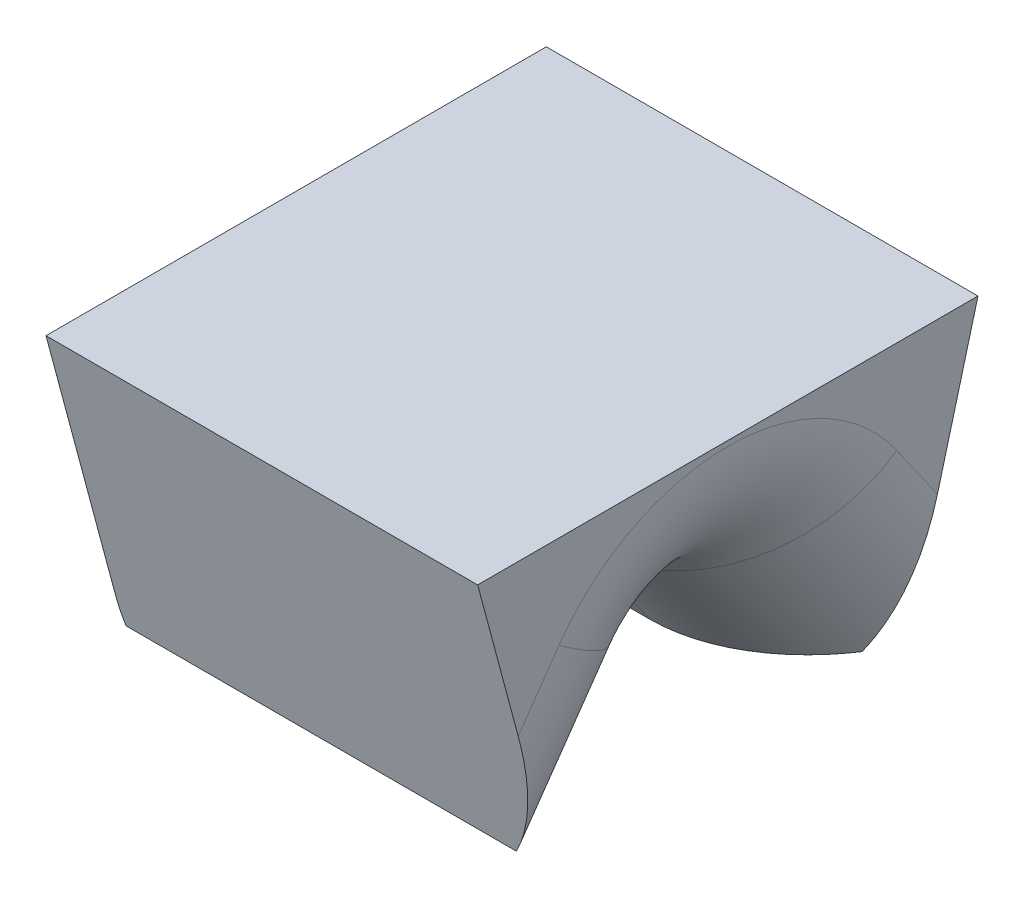
ISO-10303-21;
HEADER;
FILE_DESCRIPTION(('STEP AP214'),'2;1');
FILE_NAME('part.step','',(''),(''),'','','');
FILE_SCHEMA(('AUTOMOTIVE_DESIGN { 1 0 10303 214 1 1 1 1 }'));
ENDSEC;
DATA;
#1=APPLICATION_CONTEXT('core data for automotive mechanical design processes');
#2=APPLICATION_PROTOCOL_DEFINITION('international standard','automotive_design',2000,#1);
#3=PRODUCT_CONTEXT('',#1,'mechanical');
#4=PRODUCT('Part','Part','',(#3));
#5=PRODUCT_RELATED_PRODUCT_CATEGORY('part','',(#4));
#6=PRODUCT_DEFINITION_FORMATION('','',#4);
#7=PRODUCT_DEFINITION_CONTEXT('part definition',#1,'design');
#8=PRODUCT_DEFINITION('design','',#6,#7);
#9=PRODUCT_DEFINITION_SHAPE('','',#8);
#10=(LENGTH_UNIT() NAMED_UNIT(*) SI_UNIT(.MILLI.,.METRE.));
#11=(NAMED_UNIT(*) PLANE_ANGLE_UNIT() SI_UNIT($,.RADIAN.));
#12=(NAMED_UNIT(*) SI_UNIT($,.STERADIAN.) SOLID_ANGLE_UNIT());
#13=UNCERTAINTY_MEASURE_WITH_UNIT(LENGTH_MEASURE(1.E-05),#10,'distance_accuracy_value','');
#14=(GEOMETRIC_REPRESENTATION_CONTEXT(3) GLOBAL_UNCERTAINTY_ASSIGNED_CONTEXT((#13)) GLOBAL_UNIT_ASSIGNED_CONTEXT((#10,
#11,#12)) REPRESENTATION_CONTEXT('',''));
#15=CARTESIAN_POINT('',(0.,0.,0.));
#16=DIRECTION('',(0.,0.,1.));
#17=DIRECTION('',(1.,0.,0.));
#18=AXIS2_PLACEMENT_3D('',#15,#16,#17);
#19=CARTESIAN_POINT('',(0.,0.835526315789467,0.));
#20=DIRECTION('',(0.,1.,0.));
#21=DIRECTION('',(0.,0.,1.));
#22=AXIS2_PLACEMENT_3D('',#19,#20,#21);
#23=PLANE('',#22);
#24=DIRECTION('',(0.,0.,-1.));
#25=VECTOR('',#24,1.);
#26=CARTESIAN_POINT('',(-0.20193,0.835526315789467,2.00770998));
#27=LINE('',#26,#25);
#28=CARTESIAN_POINT('',(-0.20193,0.835526315789467,0.72425860157074));
#29=VERTEX_POINT('',#28);
#30=CARTESIAN_POINT('',(-0.20193,0.835526315789467,-0.72425860157074));
#31=VERTEX_POINT('',#30);
#32=EDGE_CURVE('E317',#29,#31,#27,.T.);
#33=ORIENTED_EDGE('',*,*,#32,.F.);
#34=DIRECTION('',(-1.,0.,0.));
#35=VECTOR('',#34,1.);
#36=CARTESIAN_POINT('',(2.00770998,0.835526315789467,0.72425860157074));
#37=LINE('',#36,#35);
#38=CARTESIAN_POINT('',(1.04775,0.835526315789467,0.72425860157074));
#39=VERTEX_POINT('',#38);
#40=EDGE_CURVE('E57',#39,#29,#37,.T.);
#41=ORIENTED_EDGE('',*,*,#40,.F.);
#42=DIRECTION('',(0.,0.,1.));
#43=VECTOR('',#42,1.);
#44=CARTESIAN_POINT('',(1.04775,0.835526315789467,2.00770998));
#45=LINE('',#44,#43);
#46=CARTESIAN_POINT('',(1.04775,0.835526315789467,-0.72425860157074));
#47=VERTEX_POINT('',#46);
#48=EDGE_CURVE('E12',#47,#39,#45,.T.);
#49=ORIENTED_EDGE('',*,*,#48,.F.);
#50=DIRECTION('',(1.,0.,0.));
#51=VECTOR('',#50,1.);
#52=CARTESIAN_POINT('',(2.00770998,0.835526315789467,-0.72425860157074));
#53=LINE('',#52,#51);
#54=EDGE_CURVE('E129',#31,#47,#53,.T.);
#55=ORIENTED_EDGE('',*,*,#54,.F.);
#56=EDGE_LOOP('',(#33,#41,#49,#55));
#57=FACE_BOUND('',#56,.T.);
#58=ADVANCED_FACE('F42',(#57),#23,.T.);
#59=CARTESIAN_POINT('',(2.00770998,0.,0.50038));
#60=DIRECTION('',(0.,-0.258819045102522,0.965925826289068));
#61=DIRECTION('',(0.,-0.965925826289068,-0.258819045102522));
#62=AXIS2_PLACEMENT_3D('',#59,#60,#61);
#63=PLANE('',#62);
#64=DIRECTION('',(0.,0.965925826289068,0.258819045102522));
#65=VECTOR('',#64,1.);
#66=CARTESIAN_POINT('',(1.04775,0.,0.50038));
#67=LINE('',#66,#65);
#68=CARTESIAN_POINT('',(1.04775,0.397467402532683,0.606881069526329));
#69=VERTEX_POINT('',#68);
#70=EDGE_CURVE('E147',#69,#39,#67,.T.);
#71=ORIENTED_EDGE('',*,*,#70,.T.);
#72=ORIENTED_EDGE('',*,*,#40,.T.);
#73=DIRECTION('',(0.,-0.965925826289068,-0.258819045102522));
#74=VECTOR('',#73,1.);
#75=CARTESIAN_POINT('',(-0.20193,0.,0.50038));
#76=LINE('',#75,#74);
#77=CARTESIAN_POINT('',(-0.20193,0.0803947960273653,0.521921720671197));
#78=VERTEX_POINT('',#77);
#79=EDGE_CURVE('E161',#29,#78,#76,.T.);
#80=ORIENTED_EDGE('',*,*,#79,.T.);
#81=CARTESIAN_POINT('',(0.0469900000000002,0.0803947960273652,0.521921720671197));
#82=DIRECTION('',(0.,-0.258819045102522,0.965925826289068));
#83=DIRECTION('',(0.,-0.965925826289068,-0.258819045102522));
#84=AXIS2_PLACEMENT_3D('',#81,#82,#83);
#85=ELLIPSE('',#84,0.324941982460591,0.24892);
#86=CARTESIAN_POINT('',(-0.193625916812148,0.,0.50038));
#87=VERTEX_POINT('',#86);
#88=EDGE_CURVE('E258',#78,#87,#85,.T.);
#89=ORIENTED_EDGE('',*,*,#88,.T.);
#90=DIRECTION('',(-1.,0.,0.));
#91=VECTOR('',#90,1.);
#92=CARTESIAN_POINT('',(2.00770998,0.,0.50038));
#93=LINE('',#92,#91);
#94=CARTESIAN_POINT('',(0.9359796221434,0.,0.50038));
#95=VERTEX_POINT('',#94);
#96=EDGE_CURVE('E163',#95,#87,#93,.T.);
#97=ORIENTED_EDGE('',*,*,#96,.F.);
#98=CARTESIAN_POINT('',(0.54737,0.397467402532683,0.606881069526329));
#99=DIRECTION('',(0.,-0.258819045102522,0.965925826289068));
#100=DIRECTION('',(0.,0.965925826289068,0.258819045102522));
#101=AXIS2_PLACEMENT_3D('',#98,#99,#100);
#102=ELLIPSE('',#101,0.653199699436086,0.50038);
#103=EDGE_CURVE('E311',#95,#69,#102,.T.);
#104=ORIENTED_EDGE('',*,*,#103,.T.);
#105=EDGE_LOOP('',(#71,#72,#80,#89,#97,#104));
#106=FACE_BOUND('',#105,.T.);
#107=ADVANCED_FACE('F214',(#106),#63,.T.);
#108=CARTESIAN_POINT('',(2.00770998,0.,-0.50038));
#109=DIRECTION('',(0.,-0.258819045102522,-0.965925826289068));
#110=DIRECTION('',(0.,0.965925826289068,-0.258819045102522));
#111=AXIS2_PLACEMENT_3D('',#108,#109,#110);
#112=PLANE('',#111);
#113=DIRECTION('',(0.,0.965925826289068,-0.258819045102522));
#114=VECTOR('',#113,1.);
#115=CARTESIAN_POINT('',(-0.20193,0.,-0.50038));
#116=LINE('',#115,#114);
#117=CARTESIAN_POINT('',(-0.20193,0.0803947960273654,-0.521921720671197));
#118=VERTEX_POINT('',#117);
#119=EDGE_CURVE('E141',#118,#31,#116,.T.);
#120=ORIENTED_EDGE('',*,*,#119,.T.);
#121=ORIENTED_EDGE('',*,*,#54,.T.);
#122=DIRECTION('',(0.,-0.965925826289068,0.258819045102522));
#123=VECTOR('',#122,1.);
#124=CARTESIAN_POINT('',(1.04775,0.,-0.50038));
#125=LINE('',#124,#123);
#126=CARTESIAN_POINT('',(1.04775,0.397467402532684,-0.606881069526329));
#127=VERTEX_POINT('',#126);
#128=EDGE_CURVE('E138',#47,#127,#125,.T.);
#129=ORIENTED_EDGE('',*,*,#128,.T.);
#130=CARTESIAN_POINT('',(0.54737,0.397467402532683,-0.606881069526329));
#131=DIRECTION('',(0.,-0.258819045102522,-0.965925826289068));
#132=DIRECTION('',(0.,-0.965925826289068,0.258819045102522));
#133=AXIS2_PLACEMENT_3D('',#130,#131,#132);
#134=ELLIPSE('',#133,0.653199699436086,0.50038);
#135=CARTESIAN_POINT('',(0.9359796221434,0.,-0.50038));
#136=VERTEX_POINT('',#135);
#137=EDGE_CURVE('E300',#127,#136,#134,.T.);
#138=ORIENTED_EDGE('',*,*,#137,.T.);
#139=DIRECTION('',(-1.,0.,0.));
#140=VECTOR('',#139,1.);
#141=CARTESIAN_POINT('',(2.00770998,0.,-0.50038));
#142=LINE('',#141,#140);
#143=CARTESIAN_POINT('',(-0.193625916812148,0.,-0.50038));
#144=VERTEX_POINT('',#143);
#145=EDGE_CURVE('E165',#136,#144,#142,.T.);
#146=ORIENTED_EDGE('',*,*,#145,.T.);
#147=CARTESIAN_POINT('',(0.0469900000000003,0.0803947960273654,-0.521921720671197));
#148=DIRECTION('',(0.,-0.258819045102522,-0.965925826289068));
#149=DIRECTION('',(0.,0.965925826289068,-0.258819045102522));
#150=AXIS2_PLACEMENT_3D('',#147,#148,#149);
#151=ELLIPSE('',#150,0.324941982460591,0.24892);
#152=EDGE_CURVE('E275',#144,#118,#151,.T.);
#153=ORIENTED_EDGE('',*,*,#152,.T.);
#154=EDGE_LOOP('',(#120,#121,#129,#138,#146,#153));
#155=FACE_BOUND('',#154,.T.);
#156=ADVANCED_FACE('F137',(#155),#112,.T.);
#157=CARTESIAN_POINT('',(-0.20193,1.61560002,2.00770998));
#158=DIRECTION('',(-1.,0.,0.));
#159=DIRECTION('',(0.,-1.,0.));
#160=AXIS2_PLACEMENT_3D('',#157,#158,#159);
#161=PLANE('',#160);
#162=ORIENTED_EDGE('',*,*,#79,.F.);
#163=ORIENTED_EDGE('',*,*,#32,.T.);
#164=ORIENTED_EDGE('',*,*,#119,.F.);
#165=DIRECTION('',(0.,-0.819152044288993,-0.573576436351045));
#166=VECTOR('',#165,1.);
#167=CARTESIAN_POINT('',(-0.20193,0.421656244173104,-0.28296788217919));
#168=LINE('',#167,#166);
#169=CARTESIAN_POINT('',(-0.20193,0.421656244173105,-0.28296788217919));
#170=VERTEX_POINT('',#169);
#171=EDGE_CURVE('E248',#118,#170,#168,.F.);
#172=ORIENTED_EDGE('',*,*,#171,.T.);
#173=CARTESIAN_POINT('',(-0.20193,0.22352,0.));
#174=DIRECTION('',(-1.,0.,0.));
#175=DIRECTION('',(0.,-1.,0.));
#176=AXIS2_PLACEMENT_3D('',#173,#174,#175);
#177=CIRCLE('',#176,0.34544);
#178=CARTESIAN_POINT('',(-0.20193,0.421656244173105,0.28296788217919));
#179=VERTEX_POINT('',#178);
#180=EDGE_CURVE('E253',#170,#179,#177,.F.);
#181=ORIENTED_EDGE('',*,*,#180,.T.);
#182=DIRECTION('',(0.,0.819152044288993,-0.573576436351045));
#183=VECTOR('',#182,1.);
#184=CARTESIAN_POINT('',(-0.20193,0.142774646536502,0.478242879112305));
#185=LINE('',#184,#183);
#186=EDGE_CURVE('E255',#179,#78,#185,.F.);
#187=ORIENTED_EDGE('',*,*,#186,.T.);
#188=EDGE_LOOP('',(#162,#163,#164,#172,#181,#187));
#189=FACE_BOUND('',#188,.T.);
#190=ADVANCED_FACE('F338',(#189),#161,.T.);
#191=CARTESIAN_POINT('',(1.04775,-0.00999998,2.00770998));
#192=DIRECTION('',(1.,0.,0.));
#193=DIRECTION('',(0.,0.,-1.));
#194=AXIS2_PLACEMENT_3D('',#191,#192,#193);
#195=PLANE('',#194);
#196=ORIENTED_EDGE('',*,*,#128,.F.);
#197=ORIENTED_EDGE('',*,*,#48,.T.);
#198=ORIENTED_EDGE('',*,*,#70,.F.);
#199=DIRECTION('',(0.,-0.819152044288993,0.573576436351045));
#200=VECTOR('',#199,1.);
#201=CARTESIAN_POINT('',(1.04775,0.565887774857939,0.488951855236099));
#202=LINE('',#201,#200);
#203=CARTESIAN_POINT('',(1.04775,0.565887774857938,0.4889518552361));
#204=VERTEX_POINT('',#203);
#205=EDGE_CURVE('E297',#69,#204,#202,.F.);
#206=ORIENTED_EDGE('',*,*,#205,.T.);
#207=CARTESIAN_POINT('',(1.04775,0.22352,0.));
#208=DIRECTION('',(1.,0.,0.));
#209=DIRECTION('',(0.,0.,-1.));
#210=AXIS2_PLACEMENT_3D('',#207,#208,#209);
#211=CIRCLE('',#210,0.5969);
#212=CARTESIAN_POINT('',(1.04775,0.565887774857938,-0.4889518552361));
#213=VERTEX_POINT('',#212);
#214=EDGE_CURVE('E293',#204,#213,#211,.F.);
#215=ORIENTED_EDGE('',*,*,#214,.T.);
#216=DIRECTION('',(0.,0.819152044288993,0.573576436351045));
#217=VECTOR('',#216,1.);
#218=CARTESIAN_POINT('',(1.04775,0.287006177221336,-0.684226852169215));
#219=LINE('',#218,#217);
#220=EDGE_CURVE('E145',#213,#127,#219,.F.);
#221=ORIENTED_EDGE('',*,*,#220,.T.);
#222=EDGE_LOOP('',(#196,#197,#198,#206,#215,#221));
#223=FACE_BOUND('',#222,.T.);
#224=ADVANCED_FACE('F143',(#223),#195,.T.);
#225=CARTESIAN_POINT('',(0.,0.,0.));
#226=DIRECTION('',(0.,1.,0.));
#227=DIRECTION('',(0.,0.,1.));
#228=AXIS2_PLACEMENT_3D('',#225,#226,#227);
#229=PLANE('',#228);
#230=ORIENTED_EDGE('',*,*,#145,.F.);
#231=CARTESIAN_POINT('',(0.54737,0.,-0.885190740972346));
#232=DIRECTION('',(0.,1.,0.));
#233=DIRECTION('',(0.,0.,-1.));
#234=AXIS2_PLACEMENT_3D('',#231,#232,#233);
#235=ELLIPSE('',#234,0.610851188724457,0.50038);
#236=CARTESIAN_POINT('',(0.54737,0.,-0.274339552247889));
#237=VERTEX_POINT('',#236);
#238=EDGE_CURVE('E302',#136,#237,#235,.F.);
#239=ORIENTED_EDGE('',*,*,#238,.T.);
#240=CARTESIAN_POINT('',(0.54737,0.,-0.274339552247889));
#241=DIRECTION('',(-1.,0.,0.));
#242=VECTOR('',#241,1.);
#243=LINE('',#240,#242);
#244=CARTESIAN_POINT('',(0.0469900000000003,0.,-0.274339552247889));
#245=VERTEX_POINT('',#244);
#246=EDGE_CURVE('E249',#237,#245,#243,.T.);
#247=ORIENTED_EDGE('',*,*,#246,.T.);
#248=CARTESIAN_POINT('',(0.0469900000000003,0.,-0.578214762882391));
#249=DIRECTION('',(0.,1.,0.));
#250=DIRECTION('',(0.,0.,1.));
#251=AXIS2_PLACEMENT_3D('',#248,#249,#250);
#252=ELLIPSE('',#251,0.303875210634501,0.24892);
#253=EDGE_CURVE('E270',#245,#144,#252,.F.);
#254=ORIENTED_EDGE('',*,*,#253,.T.);
#255=EDGE_LOOP('',(#230,#239,#247,#254));
#256=FACE_BOUND('',#255,.T.);
#257=ADVANCED_FACE('F186',(#256),#229,.F.);
#258=CARTESIAN_POINT('',(0.0469900000000003,0.,0.274339552247889));
#259=DIRECTION('',(1.,0.,0.));
#260=VECTOR('',#259,1.);
#261=LINE('',#258,#260);
#262=CARTESIAN_POINT('',(0.0469900000000002,0.,0.274339552247889));
#263=VERTEX_POINT('',#262);
#264=CARTESIAN_POINT('',(0.54737,0.,0.274339552247889));
#265=VERTEX_POINT('',#264);
#266=EDGE_CURVE('E167',#263,#265,#261,.T.);
#267=ORIENTED_EDGE('',*,*,#266,.T.);
#268=CARTESIAN_POINT('',(0.54737,0.,0.885190740972346));
#269=DIRECTION('',(0.,1.,0.));
#270=DIRECTION('',(0.,0.,-1.));
#271=AXIS2_PLACEMENT_3D('',#268,#269,#270);
#272=ELLIPSE('',#271,0.610851188724456,0.50038);
#273=EDGE_CURVE('E64',#265,#95,#272,.F.);
#274=ORIENTED_EDGE('',*,*,#273,.T.);
#275=ORIENTED_EDGE('',*,*,#96,.T.);
#276=CARTESIAN_POINT('',(0.0469900000000002,0.,0.57821476288239));
#277=DIRECTION('',(0.,1.,0.));
#278=DIRECTION('',(0.,0.,1.));
#279=AXIS2_PLACEMENT_3D('',#276,#277,#278);
#280=ELLIPSE('',#279,0.303875210634501,0.24892);
#281=EDGE_CURVE('E261',#87,#263,#280,.F.);
#282=ORIENTED_EDGE('',*,*,#281,.T.);
#283=EDGE_LOOP('',(#267,#274,#275,#282));
#284=FACE_BOUND('',#283,.T.);
#285=ADVANCED_FACE('F175',(#284),#229,.F.);
#286=CARTESIAN_POINT('',(-1.60147,0.278881597636603,-0.0790645553147735));
#287=DIRECTION('',(0.,0.573576436351045,-0.819152044288993));
#288=DIRECTION('',(0.,0.819152044288993,0.573576436351045));
#289=AXIS2_PLACEMENT_3D('',#286,#287,#288);
#290=PLANE('',#289);
#291=ORIENTED_EDGE('',*,*,#246,.F.);
#292=DIRECTION('',(0.,0.819152044288993,0.573576436351045));
#293=VECTOR('',#292,1.);
#294=CARTESIAN_POINT('',(0.54737,0.278881597636603,-0.0790645553147736));
#295=LINE('',#294,#293);
#296=CARTESIAN_POINT('',(0.54737,0.278881597636603,-0.0790645553147735));
#297=VERTEX_POINT('',#296);
#298=EDGE_CURVE('E279',#237,#297,#295,.T.);
#299=ORIENTED_EDGE('',*,*,#298,.T.);
#300=DIRECTION('',(1.,0.,0.));
#301=VECTOR('',#300,1.);
#302=CARTESIAN_POINT('',(-1.60147,0.278881597636603,-0.0790645553147735));
#303=LINE('',#302,#301);
#304=CARTESIAN_POINT('',(0.0469900000000002,0.278881597636603,-0.0790645553147735));
#305=VERTEX_POINT('',#304);
#306=EDGE_CURVE('E152',#305,#297,#303,.T.);
#307=ORIENTED_EDGE('',*,*,#306,.F.);
#308=DIRECTION('',(0.,-0.819152044288993,-0.573576436351045));
#309=VECTOR('',#308,1.);
#310=CARTESIAN_POINT('',(0.0469900000000003,0.,-0.274339552247889));
#311=LINE('',#310,#309);
#312=EDGE_CURVE('E267',#305,#245,#311,.T.);
#313=ORIENTED_EDGE('',*,*,#312,.T.);
#314=EDGE_LOOP('',(#291,#299,#307,#313));
#315=FACE_BOUND('',#314,.T.);
#316=ADVANCED_FACE('F185',(#315),#290,.F.);
#317=CARTESIAN_POINT('',(-1.60147,-0.00999998000000014,0.281341613625836));
#318=DIRECTION('',(0.,0.573576436351044,0.819152044288993));
#319=DIRECTION('',(0.,-0.819152044288993,0.573576436351045));
#320=AXIS2_PLACEMENT_3D('',#317,#318,#319);
#321=PLANE('',#320);
#322=DIRECTION('',(1.,0.,0.));
#323=VECTOR('',#322,1.);
#324=CARTESIAN_POINT('',(-1.60147,0.278881597636603,0.0790645553147736));
#325=LINE('',#324,#323);
#326=CARTESIAN_POINT('',(0.0469900000000002,0.278881597636603,0.0790645553147736));
#327=VERTEX_POINT('',#326);
#328=CARTESIAN_POINT('',(0.54737,0.278881597636603,0.0790645553147736));
#329=VERTEX_POINT('',#328);
#330=EDGE_CURVE('E148',#327,#329,#325,.T.);
#331=ORIENTED_EDGE('',*,*,#330,.T.);
#332=DIRECTION('',(0.,-0.819152044288993,0.573576436351045));
#333=VECTOR('',#332,1.);
#334=CARTESIAN_POINT('',(0.54737,0.,0.274339552247889));
#335=LINE('',#334,#333);
#336=EDGE_CURVE('E304',#329,#265,#335,.T.);
#337=ORIENTED_EDGE('',*,*,#336,.T.);
#338=ORIENTED_EDGE('',*,*,#266,.F.);
#339=DIRECTION('',(0.,0.819152044288993,-0.573576436351045));
#340=VECTOR('',#339,1.);
#341=CARTESIAN_POINT('',(0.0469900000000002,0.278881597636603,0.0790645553147733));
#342=LINE('',#341,#340);
#343=EDGE_CURVE('E246',#263,#327,#342,.T.);
#344=ORIENTED_EDGE('',*,*,#343,.T.);
#345=EDGE_LOOP('',(#331,#337,#338,#344));
#346=FACE_BOUND('',#345,.T.);
#347=ADVANCED_FACE('F223',(#346),#321,.F.);
#348=CARTESIAN_POINT('',(-1.60147,0.22352,0.));
#349=DIRECTION('',(1.,0.,0.));
#350=DIRECTION('',(0.,0.,-1.));
#351=AXIS2_PLACEMENT_3D('',#348,#349,#350);
#352=CYLINDRICAL_SURFACE('',#351,0.0965199999999999);
#353=ORIENTED_EDGE('',*,*,#306,.T.);
#354=CARTESIAN_POINT('',(0.54737,0.22352,0.));
#355=DIRECTION('',(1.,0.,0.));
#356=DIRECTION('',(0.,0.,-1.));
#357=AXIS2_PLACEMENT_3D('',#354,#355,#356);
#358=CIRCLE('',#357,0.0965199999999999);
#359=EDGE_CURVE('E50',#297,#329,#358,.T.);
#360=ORIENTED_EDGE('',*,*,#359,.T.);
#361=ORIENTED_EDGE('',*,*,#330,.F.);
#362=CARTESIAN_POINT('',(0.0469900000000002,0.22352,0.));
#363=DIRECTION('',(-1.,0.,0.));
#364=DIRECTION('',(0.,-1.,0.));
#365=AXIS2_PLACEMENT_3D('',#362,#363,#364);
#366=CIRCLE('',#365,0.0965199999999999);
#367=EDGE_CURVE('E263',#327,#305,#366,.T.);
#368=ORIENTED_EDGE('',*,*,#367,.T.);
#369=EDGE_LOOP('',(#353,#360,#361,#368));
#370=FACE_BOUND('',#369,.T.);
#371=ADVANCED_FACE('F200',(#370),#352,.F.);
#372=CARTESIAN_POINT('',(0.0469900000000002,0.421656244173105,-0.282967882179189));
#373=DIRECTION('',(0.,0.819152044288993,0.573576436351045));
#374=DIRECTION('',(0.,-0.573576436351045,0.819152044288993));
#375=AXIS2_PLACEMENT_3D('',#372,#373,#374);
#376=CYLINDRICAL_SURFACE('',#375,0.24892);
#377=ORIENTED_EDGE('',*,*,#253,.F.);
#378=ORIENTED_EDGE('',*,*,#312,.F.);
#379=CARTESIAN_POINT('',(0.0469900000000001,0.421656244173105,-0.28296788217919));
#380=DIRECTION('',(0.,0.819152044288993,0.573576436351044));
#381=DIRECTION('',(0.,-0.573576436351044,0.819152044288993));
#382=AXIS2_PLACEMENT_3D('',#379,#380,#381);
#383=CIRCLE('',#382,0.24892);
#384=EDGE_CURVE('E282',#170,#305,#383,.T.);
#385=ORIENTED_EDGE('',*,*,#384,.F.);
#386=ORIENTED_EDGE('',*,*,#171,.F.);
#387=ORIENTED_EDGE('',*,*,#152,.F.);
#388=EDGE_LOOP('',(#377,#378,#385,#386,#387));
#389=FACE_BOUND('',#388,.T.);
#390=ADVANCED_FACE('F196',(#389),#376,.T.);
#391=CARTESIAN_POINT('',(0.0469900000000002,0.22352,0.));
#392=DIRECTION('',(-1.,0.,0.));
#393=DIRECTION('',(0.,-1.,0.));
#394=AXIS2_PLACEMENT_3D('',#391,#392,#393);
#395=TOROIDAL_SURFACE('',#394,0.34544,0.24892);
#396=ORIENTED_EDGE('',*,*,#384,.T.);
#397=ORIENTED_EDGE('',*,*,#367,.F.);
#398=CARTESIAN_POINT('',(0.0469900000000001,0.421656244173105,0.28296788217919));
#399=DIRECTION('',(0.,-0.819152044288993,0.573576436351044));
#400=DIRECTION('',(0.,-0.573576436351045,-0.819152044288993));
#401=AXIS2_PLACEMENT_3D('',#398,#399,#400);
#402=CIRCLE('',#401,0.24892);
#403=EDGE_CURVE('E280',#179,#327,#402,.T.);
#404=ORIENTED_EDGE('',*,*,#403,.F.);
#405=ORIENTED_EDGE('',*,*,#180,.F.);
#406=EDGE_LOOP('',(#396,#397,#404,#405));
#407=FACE_BOUND('',#406,.T.);
#408=ADVANCED_FACE('F192',(#407),#395,.T.);
#409=CARTESIAN_POINT('',(0.0469900000000002,0.132774666536502,0.485244940490251));
#410=DIRECTION('',(0.,-0.819152044288993,0.573576436351045));
#411=DIRECTION('',(0.,-0.573576436351045,-0.819152044288993));
#412=AXIS2_PLACEMENT_3D('',#409,#410,#411);
#413=CYLINDRICAL_SURFACE('',#412,0.24892);
#414=ORIENTED_EDGE('',*,*,#88,.F.);
#415=ORIENTED_EDGE('',*,*,#186,.F.);
#416=ORIENTED_EDGE('',*,*,#403,.T.);
#417=ORIENTED_EDGE('',*,*,#343,.F.);
#418=ORIENTED_EDGE('',*,*,#281,.F.);
#419=EDGE_LOOP('',(#414,#415,#416,#417,#418));
#420=FACE_BOUND('',#419,.T.);
#421=ADVANCED_FACE('F188',(#420),#413,.T.);
#422=CARTESIAN_POINT('',(0.54737,0.277006197221335,0.691228913547162));
#423=DIRECTION('',(0.,0.819152044288993,-0.573576436351045));
#424=DIRECTION('',(0.,0.573576436351045,0.819152044288993));
#425=AXIS2_PLACEMENT_3D('',#422,#423,#424);
#426=CYLINDRICAL_SURFACE('',#425,0.50038);
#427=ORIENTED_EDGE('',*,*,#273,.F.);
#428=ORIENTED_EDGE('',*,*,#336,.F.);
#429=CARTESIAN_POINT('',(0.54737,0.565887774857938,0.4889518552361));
#430=DIRECTION('',(0.,0.819152044288993,-0.573576436351045));
#431=DIRECTION('',(0.,0.573576436351045,0.819152044288993));
#432=AXIS2_PLACEMENT_3D('',#429,#430,#431);
#433=CIRCLE('',#432,0.50038);
#434=EDGE_CURVE('E283',#204,#329,#433,.T.);
#435=ORIENTED_EDGE('',*,*,#434,.F.);
#436=ORIENTED_EDGE('',*,*,#205,.F.);
#437=ORIENTED_EDGE('',*,*,#103,.F.);
#438=EDGE_LOOP('',(#427,#428,#435,#436,#437));
#439=FACE_BOUND('',#438,.T.);
#440=ADVANCED_FACE('F44',(#439),#426,.T.);
#441=CARTESIAN_POINT('',(0.54737,0.22352,0.));
#442=DIRECTION('',(1.,0.,0.));
#443=DIRECTION('',(0.,0.,-1.));
#444=AXIS2_PLACEMENT_3D('',#441,#442,#443);
#445=TOROIDAL_SURFACE('',#444,0.5969,0.50038);
#446=ORIENTED_EDGE('',*,*,#434,.T.);
#447=ORIENTED_EDGE('',*,*,#359,.F.);
#448=CARTESIAN_POINT('',(0.54737,0.565887774857938,-0.4889518552361));
#449=DIRECTION('',(0.,-0.819152044288993,-0.573576436351045));
#450=DIRECTION('',(0.,0.573576436351045,-0.819152044288993));
#451=AXIS2_PLACEMENT_3D('',#448,#449,#450);
#452=CIRCLE('',#451,0.50038);
#453=EDGE_CURVE('E316',#213,#297,#452,.T.);
#454=ORIENTED_EDGE('',*,*,#453,.F.);
#455=ORIENTED_EDGE('',*,*,#214,.F.);
#456=EDGE_LOOP('',(#446,#447,#454,#455));
#457=FACE_BOUND('',#456,.T.);
#458=ADVANCED_FACE('F204',(#457),#445,.T.);
#459=CARTESIAN_POINT('',(0.54737,0.565887774857938,-0.4889518552361));
#460=DIRECTION('',(0.,-0.819152044288993,-0.573576436351045));
#461=DIRECTION('',(0.,0.573576436351045,-0.819152044288993));
#462=AXIS2_PLACEMENT_3D('',#459,#460,#461);
#463=CYLINDRICAL_SURFACE('',#462,0.50038);
#464=ORIENTED_EDGE('',*,*,#137,.F.);
#465=ORIENTED_EDGE('',*,*,#220,.F.);
#466=ORIENTED_EDGE('',*,*,#453,.T.);
#467=ORIENTED_EDGE('',*,*,#298,.F.);
#468=ORIENTED_EDGE('',*,*,#238,.F.);
#469=EDGE_LOOP('',(#464,#465,#466,#467,#468));
#470=FACE_BOUND('',#469,.T.);
#471=ADVANCED_FACE('F202',(#470),#463,.T.);
#472=CLOSED_SHELL('',(#58,#107,#156,#190,#224,#257,#285,#316,#347,#371,#390,#408,#421,#440,#458,#471));
#473=MANIFOLD_SOLID_BREP('B2',#472);
#474=ADVANCED_BREP_SHAPE_REPRESENTATION('',(#18,#473),#14);
#475=SHAPE_DEFINITION_REPRESENTATION(#9,#474);
ENDSEC;
END-ISO-10303-21;
